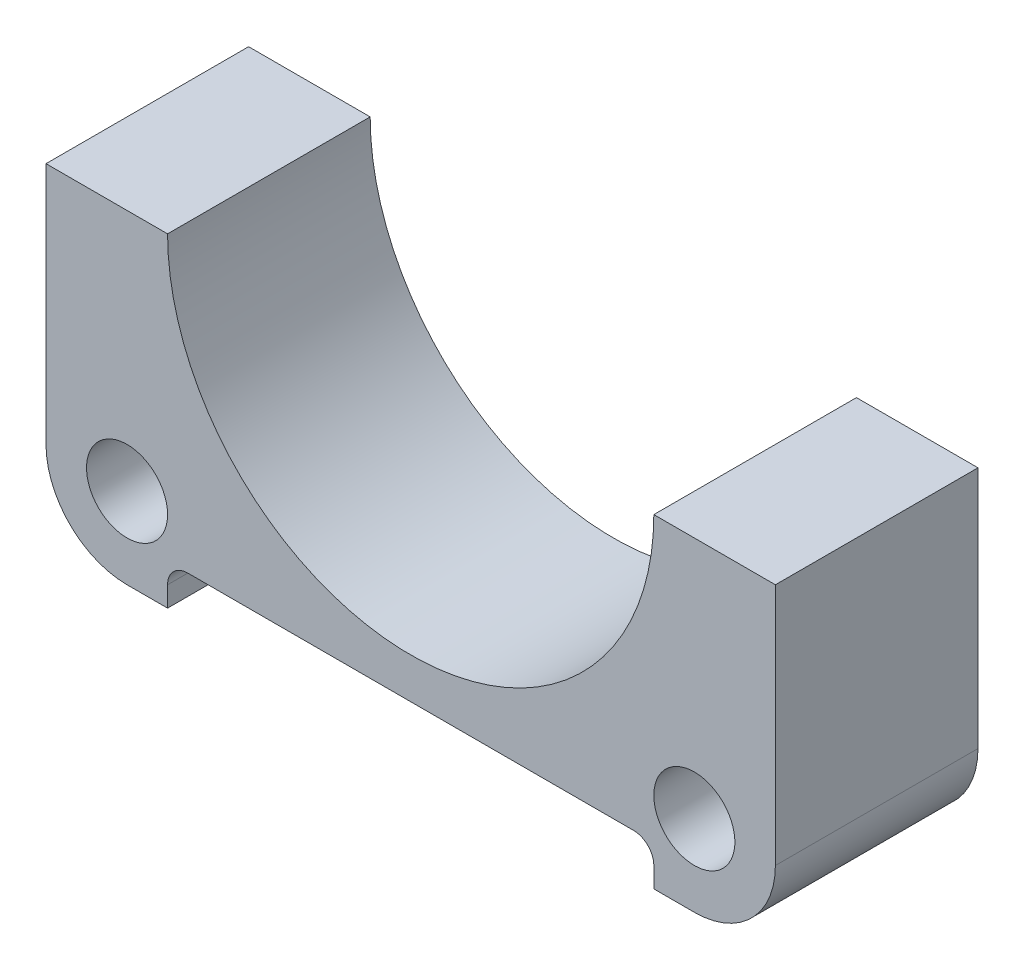
ISO-10303-21;
HEADER;
FILE_DESCRIPTION(('STEP AP214'),'2;1');
FILE_NAME('part.step','',(''),(''),'','','');
FILE_SCHEMA(('AUTOMOTIVE_DESIGN { 1 0 10303 214 1 1 1 1 }'));
ENDSEC;
DATA;
#1=APPLICATION_CONTEXT('core data for automotive mechanical design processes');
#2=APPLICATION_PROTOCOL_DEFINITION('international standard','automotive_design',2000,#1);
#3=PRODUCT_CONTEXT('',#1,'mechanical');
#4=PRODUCT('Part','Part','',(#3));
#5=PRODUCT_RELATED_PRODUCT_CATEGORY('part','',(#4));
#6=PRODUCT_DEFINITION_FORMATION('','',#4);
#7=PRODUCT_DEFINITION_CONTEXT('part definition',#1,'design');
#8=PRODUCT_DEFINITION('design','',#6,#7);
#9=PRODUCT_DEFINITION_SHAPE('','',#8);
#10=(LENGTH_UNIT() NAMED_UNIT(*) SI_UNIT(.MILLI.,.METRE.));
#11=(NAMED_UNIT(*) PLANE_ANGLE_UNIT() SI_UNIT($,.RADIAN.));
#12=(NAMED_UNIT(*) SI_UNIT($,.STERADIAN.) SOLID_ANGLE_UNIT());
#13=UNCERTAINTY_MEASURE_WITH_UNIT(LENGTH_MEASURE(1.E-05),#10,'distance_accuracy_value','');
#14=(GEOMETRIC_REPRESENTATION_CONTEXT(3) GLOBAL_UNCERTAINTY_ASSIGNED_CONTEXT((#13)) GLOBAL_UNIT_ASSIGNED_CONTEXT((#10,
#11,#12)) REPRESENTATION_CONTEXT('',''));
#15=CARTESIAN_POINT('',(0.,0.,0.));
#16=DIRECTION('',(0.,0.,1.));
#17=DIRECTION('',(1.,0.,0.));
#18=AXIS2_PLACEMENT_3D('',#15,#16,#17);
#19=CARTESIAN_POINT('',(0.,0.,50.));
#20=DIRECTION('',(0.,0.,1.));
#21=DIRECTION('',(1.,0.,0.));
#22=AXIS2_PLACEMENT_3D('',#19,#20,#21);
#23=PLANE('',#22);
#24=CARTESIAN_POINT('',(-70.,-60.,50.));
#25=DIRECTION('',(0.,0.,1.));
#26=DIRECTION('',(1.,0.,0.));
#27=AXIS2_PLACEMENT_3D('',#24,#25,#26);
#28=CIRCLE('',#27,10.);
#29=CARTESIAN_POINT('',(-60.,-60.,50.));
#30=VERTEX_POINT('',#29);
#31=EDGE_CURVE('E186',#30,#30,#28,.T.);
#32=ORIENTED_EDGE('',*,*,#31,.F.);
#33=EDGE_LOOP('',(#32));
#34=FACE_BOUND('',#33,.T.);
#35=CARTESIAN_POINT('',(0.,0.,50.));
#36=DIRECTION('',(0.,0.,-1.));
#37=DIRECTION('',(1.,0.,0.));
#38=AXIS2_PLACEMENT_3D('',#35,#36,#37);
#39=CIRCLE('',#38,60.);
#40=CARTESIAN_POINT('',(60.,0.,50.));
#41=VERTEX_POINT('',#40);
#42=CARTESIAN_POINT('',(-60.,0.,50.));
#43=VERTEX_POINT('',#42);
#44=EDGE_CURVE('E223',#41,#43,#39,.T.);
#45=ORIENTED_EDGE('',*,*,#44,.T.);
#46=DIRECTION('',(-1.,0.,0.));
#47=VECTOR('',#46,1.);
#48=CARTESIAN_POINT('',(-60.,0.,50.));
#49=LINE('',#48,#47);
#50=CARTESIAN_POINT('',(-90.,0.,50.));
#51=VERTEX_POINT('',#50);
#52=EDGE_CURVE('E121',#43,#51,#49,.T.);
#53=ORIENTED_EDGE('',*,*,#52,.T.);
#54=DIRECTION('',(0.,-1.,0.));
#55=VECTOR('',#54,1.);
#56=CARTESIAN_POINT('',(-90.,0.,50.));
#57=LINE('',#56,#55);
#58=CARTESIAN_POINT('',(-90.,-59.9999999999999,50.));
#59=VERTEX_POINT('',#58);
#60=EDGE_CURVE('E267',#51,#59,#57,.T.);
#61=ORIENTED_EDGE('',*,*,#60,.T.);
#62=CARTESIAN_POINT('',(-70.,-60.,50.));
#63=DIRECTION('',(0.,0.,1.));
#64=DIRECTION('',(-1.,0.,0.));
#65=AXIS2_PLACEMENT_3D('',#62,#63,#64);
#66=CIRCLE('',#65,20.);
#67=CARTESIAN_POINT('',(-69.9999999999998,-80.,50.));
#68=VERTEX_POINT('',#67);
#69=EDGE_CURVE('E289',#59,#68,#66,.T.);
#70=ORIENTED_EDGE('',*,*,#69,.T.);
#71=DIRECTION('',(1.,0.,0.));
#72=VECTOR('',#71,1.);
#73=CARTESIAN_POINT('',(-69.9999999999998,-80.,50.));
#74=LINE('',#73,#72);
#75=CARTESIAN_POINT('',(-60.,-80.,50.));
#76=VERTEX_POINT('',#75);
#77=EDGE_CURVE('E285',#68,#76,#74,.T.);
#78=ORIENTED_EDGE('',*,*,#77,.T.);
#79=DIRECTION('',(0.,1.,0.));
#80=VECTOR('',#79,1.);
#81=CARTESIAN_POINT('',(-60.,-80.,50.));
#82=LINE('',#81,#80);
#83=CARTESIAN_POINT('',(-60.,-75.0000000000001,50.));
#84=VERTEX_POINT('',#83);
#85=EDGE_CURVE('E288',#76,#84,#82,.T.);
#86=ORIENTED_EDGE('',*,*,#85,.T.);
#87=CARTESIAN_POINT('',(-55.,-75.,50.));
#88=DIRECTION('',(0.,0.,-1.));
#89=DIRECTION('',(-1.,0.,0.));
#90=AXIS2_PLACEMENT_3D('',#87,#88,#89);
#91=CIRCLE('',#90,5.);
#92=CARTESIAN_POINT('',(-54.9999999999999,-70.,50.));
#93=VERTEX_POINT('',#92);
#94=EDGE_CURVE('E293',#84,#93,#91,.T.);
#95=ORIENTED_EDGE('',*,*,#94,.T.);
#96=DIRECTION('',(1.,0.,0.));
#97=VECTOR('',#96,1.);
#98=CARTESIAN_POINT('',(-54.9999999999999,-70.,50.));
#99=LINE('',#98,#97);
#100=CARTESIAN_POINT('',(54.9999999999999,-70.,50.));
#101=VERTEX_POINT('',#100);
#102=EDGE_CURVE('E300',#93,#101,#99,.T.);
#103=ORIENTED_EDGE('',*,*,#102,.T.);
#104=CARTESIAN_POINT('',(55.,-75.,50.));
#105=DIRECTION('',(0.,0.,-1.));
#106=DIRECTION('',(1.,0.,0.));
#107=AXIS2_PLACEMENT_3D('',#104,#105,#106);
#108=CIRCLE('',#107,5.);
#109=CARTESIAN_POINT('',(60.,-75.0000000000001,50.));
#110=VERTEX_POINT('',#109);
#111=EDGE_CURVE('E303',#101,#110,#108,.T.);
#112=ORIENTED_EDGE('',*,*,#111,.T.);
#113=DIRECTION('',(0.,-1.,0.));
#114=VECTOR('',#113,1.);
#115=CARTESIAN_POINT('',(60.,-80.,50.));
#116=LINE('',#115,#114);
#117=CARTESIAN_POINT('',(60.,-80.,50.));
#118=VERTEX_POINT('',#117);
#119=EDGE_CURVE('E306',#110,#118,#116,.T.);
#120=ORIENTED_EDGE('',*,*,#119,.T.);
#121=DIRECTION('',(1.,0.,0.));
#122=VECTOR('',#121,1.);
#123=CARTESIAN_POINT('',(69.9999999999998,-80.,50.));
#124=LINE('',#123,#122);
#125=CARTESIAN_POINT('',(69.9999999999998,-80.,50.));
#126=VERTEX_POINT('',#125);
#127=EDGE_CURVE('E158',#118,#126,#124,.T.);
#128=ORIENTED_EDGE('',*,*,#127,.T.);
#129=CARTESIAN_POINT('',(70.,-60.,50.));
#130=DIRECTION('',(0.,0.,1.));
#131=DIRECTION('',(1.,0.,0.));
#132=AXIS2_PLACEMENT_3D('',#129,#130,#131);
#133=CIRCLE('',#132,20.);
#134=CARTESIAN_POINT('',(90.,-60.,50.));
#135=VERTEX_POINT('',#134);
#136=EDGE_CURVE('E152',#126,#135,#133,.T.);
#137=ORIENTED_EDGE('',*,*,#136,.T.);
#138=DIRECTION('',(0.,1.,0.));
#139=VECTOR('',#138,1.);
#140=CARTESIAN_POINT('',(90.,-7.72372418851806,50.));
#141=LINE('',#140,#139);
#142=CARTESIAN_POINT('',(90.,0.,50.));
#143=VERTEX_POINT('',#142);
#144=EDGE_CURVE('E156',#135,#143,#141,.T.);
#145=ORIENTED_EDGE('',*,*,#144,.T.);
#146=DIRECTION('',(-1.,0.,0.));
#147=VECTOR('',#146,1.);
#148=CARTESIAN_POINT('',(60.,0.,50.));
#149=LINE('',#148,#147);
#150=EDGE_CURVE('E61',#143,#41,#149,.T.);
#151=ORIENTED_EDGE('',*,*,#150,.T.);
#152=EDGE_LOOP('',(#45,#53,#61,#70,#78,#86,#95,#103,#112,#120,#128,#137,#145,#151));
#153=FACE_BOUND('',#152,.T.);
#154=CARTESIAN_POINT('',(70.,-60.,50.));
#155=DIRECTION('',(0.,0.,1.));
#156=DIRECTION('',(-1.,0.,0.));
#157=AXIS2_PLACEMENT_3D('',#154,#155,#156);
#158=CIRCLE('',#157,10.);
#159=CARTESIAN_POINT('',(60.,-60.,50.));
#160=VERTEX_POINT('',#159);
#161=EDGE_CURVE('E536',#160,#160,#158,.T.);
#162=ORIENTED_EDGE('',*,*,#161,.F.);
#163=EDGE_LOOP('',(#162));
#164=FACE_BOUND('',#163,.T.);
#165=ADVANCED_FACE('F43',(#34,#153,#164),#23,.T.);
#166=CARTESIAN_POINT('',(0.,0.,0.));
#167=DIRECTION('',(0.,0.,1.));
#168=DIRECTION('',(1.,0.,0.));
#169=AXIS2_PLACEMENT_3D('',#166,#167,#168);
#170=PLANE('',#169);
#171=CARTESIAN_POINT('',(0.,0.,0.));
#172=DIRECTION('',(0.,0.,-1.));
#173=DIRECTION('',(1.,0.,0.));
#174=AXIS2_PLACEMENT_3D('',#171,#172,#173);
#175=CIRCLE('',#174,60.);
#176=CARTESIAN_POINT('',(60.,0.,0.));
#177=VERTEX_POINT('',#176);
#178=CARTESIAN_POINT('',(-60.,0.,0.));
#179=VERTEX_POINT('',#178);
#180=EDGE_CURVE('E181',#177,#179,#175,.T.);
#181=ORIENTED_EDGE('',*,*,#180,.F.);
#182=DIRECTION('',(-1.,0.,0.));
#183=VECTOR('',#182,1.);
#184=CARTESIAN_POINT('',(60.,0.,0.));
#185=LINE('',#184,#183);
#186=CARTESIAN_POINT('',(90.,0.,0.));
#187=VERTEX_POINT('',#186);
#188=EDGE_CURVE('E113',#187,#177,#185,.T.);
#189=ORIENTED_EDGE('',*,*,#188,.F.);
#190=DIRECTION('',(0.,1.,0.));
#191=VECTOR('',#190,1.);
#192=CARTESIAN_POINT('',(90.,0.,0.));
#193=LINE('',#192,#191);
#194=CARTESIAN_POINT('',(90.,-60.,0.));
#195=VERTEX_POINT('',#194);
#196=EDGE_CURVE('E107',#195,#187,#193,.T.);
#197=ORIENTED_EDGE('',*,*,#196,.F.);
#198=CARTESIAN_POINT('',(70.,-60.,0.));
#199=DIRECTION('',(0.,0.,1.));
#200=DIRECTION('',(1.,0.,0.));
#201=AXIS2_PLACEMENT_3D('',#198,#199,#200);
#202=CIRCLE('',#201,20.);
#203=CARTESIAN_POINT('',(69.9999999999998,-80.,0.));
#204=VERTEX_POINT('',#203);
#205=EDGE_CURVE('E168',#204,#195,#202,.T.);
#206=ORIENTED_EDGE('',*,*,#205,.F.);
#207=DIRECTION('',(1.,0.,0.));
#208=VECTOR('',#207,1.);
#209=CARTESIAN_POINT('',(69.9999999999998,-80.,0.));
#210=LINE('',#209,#208);
#211=CARTESIAN_POINT('',(60.,-80.,0.));
#212=VERTEX_POINT('',#211);
#213=EDGE_CURVE('E214',#212,#204,#210,.T.);
#214=ORIENTED_EDGE('',*,*,#213,.F.);
#215=DIRECTION('',(0.,-1.,0.));
#216=VECTOR('',#215,1.);
#217=CARTESIAN_POINT('',(60.,-80.,0.));
#218=LINE('',#217,#216);
#219=CARTESIAN_POINT('',(60.,-75.0000000000001,0.));
#220=VERTEX_POINT('',#219);
#221=EDGE_CURVE('E211',#220,#212,#218,.T.);
#222=ORIENTED_EDGE('',*,*,#221,.F.);
#223=CARTESIAN_POINT('',(55.,-75.,0.));
#224=DIRECTION('',(0.,0.,-1.));
#225=DIRECTION('',(1.,0.,0.));
#226=AXIS2_PLACEMENT_3D('',#223,#224,#225);
#227=CIRCLE('',#226,5.);
#228=CARTESIAN_POINT('',(54.9999999999999,-70.,0.));
#229=VERTEX_POINT('',#228);
#230=EDGE_CURVE('E208',#229,#220,#227,.T.);
#231=ORIENTED_EDGE('',*,*,#230,.F.);
#232=DIRECTION('',(1.,0.,0.));
#233=VECTOR('',#232,1.);
#234=CARTESIAN_POINT('',(-54.9999999999999,-70.,0.));
#235=LINE('',#234,#233);
#236=CARTESIAN_POINT('',(-54.9999999999999,-70.,0.));
#237=VERTEX_POINT('',#236);
#238=EDGE_CURVE('E205',#237,#229,#235,.T.);
#239=ORIENTED_EDGE('',*,*,#238,.F.);
#240=CARTESIAN_POINT('',(-55.,-75.,0.));
#241=DIRECTION('',(0.,0.,-1.));
#242=DIRECTION('',(-1.,0.,0.));
#243=AXIS2_PLACEMENT_3D('',#240,#241,#242);
#244=CIRCLE('',#243,5.);
#245=CARTESIAN_POINT('',(-60.,-75.0000000000001,0.));
#246=VERTEX_POINT('',#245);
#247=EDGE_CURVE('E202',#246,#237,#244,.T.);
#248=ORIENTED_EDGE('',*,*,#247,.F.);
#249=DIRECTION('',(0.,1.,0.));
#250=VECTOR('',#249,1.);
#251=CARTESIAN_POINT('',(-60.,-80.,0.));
#252=LINE('',#251,#250);
#253=CARTESIAN_POINT('',(-60.,-80.,0.));
#254=VERTEX_POINT('',#253);
#255=EDGE_CURVE('E199',#254,#246,#252,.T.);
#256=ORIENTED_EDGE('',*,*,#255,.F.);
#257=DIRECTION('',(1.,0.,0.));
#258=VECTOR('',#257,1.);
#259=CARTESIAN_POINT('',(-69.9999999999998,-80.,0.));
#260=LINE('',#259,#258);
#261=CARTESIAN_POINT('',(-69.9999999999998,-80.,0.));
#262=VERTEX_POINT('',#261);
#263=EDGE_CURVE('E196',#262,#254,#260,.T.);
#264=ORIENTED_EDGE('',*,*,#263,.F.);
#265=CARTESIAN_POINT('',(-70.,-60.,0.));
#266=DIRECTION('',(0.,0.,1.));
#267=DIRECTION('',(-1.,0.,0.));
#268=AXIS2_PLACEMENT_3D('',#265,#266,#267);
#269=CIRCLE('',#268,20.);
#270=CARTESIAN_POINT('',(-90.,-59.9999999999999,0.));
#271=VERTEX_POINT('',#270);
#272=EDGE_CURVE('E193',#271,#262,#269,.T.);
#273=ORIENTED_EDGE('',*,*,#272,.F.);
#274=DIRECTION('',(0.,-1.,0.));
#275=VECTOR('',#274,1.);
#276=CARTESIAN_POINT('',(-90.,-7.72372418851808,0.));
#277=LINE('',#276,#275);
#278=CARTESIAN_POINT('',(-90.,0.,0.));
#279=VERTEX_POINT('',#278);
#280=EDGE_CURVE('E190',#279,#271,#277,.T.);
#281=ORIENTED_EDGE('',*,*,#280,.F.);
#282=DIRECTION('',(-1.,0.,0.));
#283=VECTOR('',#282,1.);
#284=CARTESIAN_POINT('',(-60.,0.,0.));
#285=LINE('',#284,#283);
#286=EDGE_CURVE('E185',#179,#279,#285,.T.);
#287=ORIENTED_EDGE('',*,*,#286,.F.);
#288=EDGE_LOOP('',(#181,#189,#197,#206,#214,#222,#231,#239,#248,#256,#264,#273,#281,#287));
#289=FACE_BOUND('',#288,.T.);
#290=CARTESIAN_POINT('',(-70.,-60.,0.));
#291=DIRECTION('',(0.,0.,1.));
#292=DIRECTION('',(1.,0.,0.));
#293=AXIS2_PLACEMENT_3D('',#290,#291,#292);
#294=CIRCLE('',#293,10.);
#295=CARTESIAN_POINT('',(-60.,-60.,0.));
#296=VERTEX_POINT('',#295);
#297=EDGE_CURVE('E531',#296,#296,#294,.T.);
#298=ORIENTED_EDGE('',*,*,#297,.T.);
#299=EDGE_LOOP('',(#298));
#300=FACE_BOUND('',#299,.T.);
#301=CARTESIAN_POINT('',(70.,-60.,0.));
#302=DIRECTION('',(0.,0.,1.));
#303=DIRECTION('',(-1.,0.,0.));
#304=AXIS2_PLACEMENT_3D('',#301,#302,#303);
#305=CIRCLE('',#304,10.);
#306=CARTESIAN_POINT('',(60.,-60.,0.));
#307=VERTEX_POINT('',#306);
#308=EDGE_CURVE('E540',#307,#307,#305,.T.);
#309=ORIENTED_EDGE('',*,*,#308,.T.);
#310=EDGE_LOOP('',(#309));
#311=FACE_BOUND('',#310,.T.);
#312=ADVANCED_FACE('F272',(#289,#300,#311),#170,.F.);
#313=CARTESIAN_POINT('',(0.,0.,50.));
#314=DIRECTION('',(0.,0.,-1.));
#315=DIRECTION('',(-1.,0.,0.));
#316=AXIS2_PLACEMENT_3D('',#313,#314,#315);
#317=CYLINDRICAL_SURFACE('',#316,60.);
#318=ORIENTED_EDGE('',*,*,#180,.T.);
#319=DIRECTION('',(0.,0.,-1.));
#320=VECTOR('',#319,1.);
#321=CARTESIAN_POINT('',(-60.,0.,50.));
#322=LINE('',#321,#320);
#323=EDGE_CURVE('E11',#43,#179,#322,.T.);
#324=ORIENTED_EDGE('',*,*,#323,.F.);
#325=ORIENTED_EDGE('',*,*,#44,.F.);
#326=DIRECTION('',(0.,0.,-1.));
#327=VECTOR('',#326,1.);
#328=CARTESIAN_POINT('',(60.,0.,50.));
#329=LINE('',#328,#327);
#330=EDGE_CURVE('E177',#41,#177,#329,.T.);
#331=ORIENTED_EDGE('',*,*,#330,.T.);
#332=EDGE_LOOP('',(#318,#324,#325,#331));
#333=FACE_BOUND('',#332,.T.);
#334=ADVANCED_FACE('F45',(#333),#317,.F.);
#335=CARTESIAN_POINT('',(-60.,0.,50.));
#336=DIRECTION('',(0.,-1.,0.));
#337=DIRECTION('',(1.,0.,0.));
#338=AXIS2_PLACEMENT_3D('',#335,#336,#337);
#339=PLANE('',#338);
#340=ORIENTED_EDGE('',*,*,#286,.T.);
#341=DIRECTION('',(0.,0.,-1.));
#342=VECTOR('',#341,1.);
#343=CARTESIAN_POINT('',(-90.,0.,50.));
#344=LINE('',#343,#342);
#345=EDGE_CURVE('E53',#51,#279,#344,.T.);
#346=ORIENTED_EDGE('',*,*,#345,.F.);
#347=ORIENTED_EDGE('',*,*,#52,.F.);
#348=ORIENTED_EDGE('',*,*,#323,.T.);
#349=EDGE_LOOP('',(#340,#346,#347,#348));
#350=FACE_BOUND('',#349,.T.);
#351=ADVANCED_FACE('F268',(#350),#339,.F.);
#352=CARTESIAN_POINT('',(-90.,-7.72372418851808,50.));
#353=DIRECTION('',(1.,0.,0.));
#354=DIRECTION('',(0.,1.,0.));
#355=AXIS2_PLACEMENT_3D('',#352,#353,#354);
#356=PLANE('',#355);
#357=ORIENTED_EDGE('',*,*,#280,.T.);
#358=DIRECTION('',(0.,0.,-1.));
#359=VECTOR('',#358,1.);
#360=CARTESIAN_POINT('',(-90.,-59.9999999999999,50.));
#361=LINE('',#360,#359);
#362=EDGE_CURVE('E258',#59,#271,#361,.T.);
#363=ORIENTED_EDGE('',*,*,#362,.F.);
#364=ORIENTED_EDGE('',*,*,#60,.F.);
#365=ORIENTED_EDGE('',*,*,#345,.T.);
#366=EDGE_LOOP('',(#357,#363,#364,#365));
#367=FACE_BOUND('',#366,.T.);
#368=ADVANCED_FACE('F265',(#367),#356,.F.);
#369=CARTESIAN_POINT('',(-70.,-60.,50.));
#370=DIRECTION('',(0.,0.,-1.));
#371=DIRECTION('',(-1.,0.,0.));
#372=AXIS2_PLACEMENT_3D('',#369,#370,#371);
#373=CYLINDRICAL_SURFACE('',#372,20.);
#374=ORIENTED_EDGE('',*,*,#272,.T.);
#375=DIRECTION('',(0.,0.,-1.));
#376=VECTOR('',#375,1.);
#377=CARTESIAN_POINT('',(-69.9999999999998,-80.,50.));
#378=LINE('',#377,#376);
#379=EDGE_CURVE('E254',#68,#262,#378,.T.);
#380=ORIENTED_EDGE('',*,*,#379,.F.);
#381=ORIENTED_EDGE('',*,*,#69,.F.);
#382=ORIENTED_EDGE('',*,*,#362,.T.);
#383=EDGE_LOOP('',(#374,#380,#381,#382));
#384=FACE_BOUND('',#383,.T.);
#385=ADVANCED_FACE('F279',(#384),#373,.T.);
#386=CARTESIAN_POINT('',(-69.9999999999998,-80.,50.));
#387=DIRECTION('',(0.,1.,0.));
#388=DIRECTION('',(0.,0.,1.));
#389=AXIS2_PLACEMENT_3D('',#386,#387,#388);
#390=PLANE('',#389);
#391=ORIENTED_EDGE('',*,*,#263,.T.);
#392=DIRECTION('',(0.,0.,-1.));
#393=VECTOR('',#392,1.);
#394=CARTESIAN_POINT('',(-60.,-80.,50.));
#395=LINE('',#394,#393);
#396=EDGE_CURVE('E250',#76,#254,#395,.T.);
#397=ORIENTED_EDGE('',*,*,#396,.F.);
#398=ORIENTED_EDGE('',*,*,#77,.F.);
#399=ORIENTED_EDGE('',*,*,#379,.T.);
#400=EDGE_LOOP('',(#391,#397,#398,#399));
#401=FACE_BOUND('',#400,.T.);
#402=ADVANCED_FACE('F283',(#401),#390,.F.);
#403=CARTESIAN_POINT('',(-60.,-80.,50.));
#404=DIRECTION('',(-1.,0.,0.));
#405=DIRECTION('',(0.,0.,1.));
#406=AXIS2_PLACEMENT_3D('',#403,#404,#405);
#407=PLANE('',#406);
#408=ORIENTED_EDGE('',*,*,#255,.T.);
#409=DIRECTION('',(0.,0.,-1.));
#410=VECTOR('',#409,1.);
#411=CARTESIAN_POINT('',(-60.,-75.0000000000001,50.));
#412=LINE('',#411,#410);
#413=EDGE_CURVE('E246',#84,#246,#412,.T.);
#414=ORIENTED_EDGE('',*,*,#413,.F.);
#415=ORIENTED_EDGE('',*,*,#85,.F.);
#416=ORIENTED_EDGE('',*,*,#396,.T.);
#417=EDGE_LOOP('',(#408,#414,#415,#416));
#418=FACE_BOUND('',#417,.T.);
#419=ADVANCED_FACE('F334',(#418),#407,.F.);
#420=CARTESIAN_POINT('',(-55.,-75.,50.));
#421=DIRECTION('',(0.,0.,-1.));
#422=DIRECTION('',(-1.,0.,0.));
#423=AXIS2_PLACEMENT_3D('',#420,#421,#422);
#424=CYLINDRICAL_SURFACE('',#423,5.);
#425=ORIENTED_EDGE('',*,*,#247,.T.);
#426=DIRECTION('',(0.,0.,-1.));
#427=VECTOR('',#426,1.);
#428=CARTESIAN_POINT('',(-54.9999999999999,-70.,50.));
#429=LINE('',#428,#427);
#430=EDGE_CURVE('E242',#93,#237,#429,.T.);
#431=ORIENTED_EDGE('',*,*,#430,.F.);
#432=ORIENTED_EDGE('',*,*,#94,.F.);
#433=ORIENTED_EDGE('',*,*,#413,.T.);
#434=EDGE_LOOP('',(#425,#431,#432,#433));
#435=FACE_BOUND('',#434,.T.);
#436=ADVANCED_FACE('F331',(#435),#424,.F.);
#437=CARTESIAN_POINT('',(-54.9999999999999,-70.,50.));
#438=DIRECTION('',(0.,1.,0.));
#439=DIRECTION('',(0.,0.,1.));
#440=AXIS2_PLACEMENT_3D('',#437,#438,#439);
#441=PLANE('',#440);
#442=ORIENTED_EDGE('',*,*,#238,.T.);
#443=DIRECTION('',(0.,0.,-1.));
#444=VECTOR('',#443,1.);
#445=CARTESIAN_POINT('',(54.9999999999999,-70.,50.));
#446=LINE('',#445,#444);
#447=EDGE_CURVE('E238',#101,#229,#446,.T.);
#448=ORIENTED_EDGE('',*,*,#447,.F.);
#449=ORIENTED_EDGE('',*,*,#102,.F.);
#450=ORIENTED_EDGE('',*,*,#430,.T.);
#451=EDGE_LOOP('',(#442,#448,#449,#450));
#452=FACE_BOUND('',#451,.T.);
#453=ADVANCED_FACE('F327',(#452),#441,.F.);
#454=CARTESIAN_POINT('',(55.,-75.,50.));
#455=DIRECTION('',(0.,0.,-1.));
#456=DIRECTION('',(-1.,0.,0.));
#457=AXIS2_PLACEMENT_3D('',#454,#455,#456);
#458=CYLINDRICAL_SURFACE('',#457,5.);
#459=ORIENTED_EDGE('',*,*,#230,.T.);
#460=DIRECTION('',(0.,0.,-1.));
#461=VECTOR('',#460,1.);
#462=CARTESIAN_POINT('',(60.,-75.0000000000001,50.));
#463=LINE('',#462,#461);
#464=EDGE_CURVE('E234',#110,#220,#463,.T.);
#465=ORIENTED_EDGE('',*,*,#464,.F.);
#466=ORIENTED_EDGE('',*,*,#111,.F.);
#467=ORIENTED_EDGE('',*,*,#447,.T.);
#468=EDGE_LOOP('',(#459,#465,#466,#467));
#469=FACE_BOUND('',#468,.T.);
#470=ADVANCED_FACE('F323',(#469),#458,.F.);
#471=CARTESIAN_POINT('',(60.,-80.,50.));
#472=DIRECTION('',(1.,0.,0.));
#473=DIRECTION('',(0.,1.,0.));
#474=AXIS2_PLACEMENT_3D('',#471,#472,#473);
#475=PLANE('',#474);
#476=ORIENTED_EDGE('',*,*,#221,.T.);
#477=DIRECTION('',(0.,0.,-1.));
#478=VECTOR('',#477,1.);
#479=CARTESIAN_POINT('',(60.,-80.,50.));
#480=LINE('',#479,#478);
#481=EDGE_CURVE('E230',#118,#212,#480,.T.);
#482=ORIENTED_EDGE('',*,*,#481,.F.);
#483=ORIENTED_EDGE('',*,*,#119,.F.);
#484=ORIENTED_EDGE('',*,*,#464,.T.);
#485=EDGE_LOOP('',(#476,#482,#483,#484));
#486=FACE_BOUND('',#485,.T.);
#487=ADVANCED_FACE('F314',(#486),#475,.F.);
#488=CARTESIAN_POINT('',(69.9999999999998,-80.,50.));
#489=DIRECTION('',(0.,1.,0.));
#490=DIRECTION('',(0.,0.,1.));
#491=AXIS2_PLACEMENT_3D('',#488,#489,#490);
#492=PLANE('',#491);
#493=ORIENTED_EDGE('',*,*,#213,.T.);
#494=DIRECTION('',(0.,0.,-1.));
#495=VECTOR('',#494,1.);
#496=CARTESIAN_POINT('',(69.9999999999998,-80.,50.));
#497=LINE('',#496,#495);
#498=EDGE_CURVE('E170',#126,#204,#497,.T.);
#499=ORIENTED_EDGE('',*,*,#498,.F.);
#500=ORIENTED_EDGE('',*,*,#127,.F.);
#501=ORIENTED_EDGE('',*,*,#481,.T.);
#502=EDGE_LOOP('',(#493,#499,#500,#501));
#503=FACE_BOUND('',#502,.T.);
#504=ADVANCED_FACE('F318',(#503),#492,.F.);
#505=CARTESIAN_POINT('',(70.,-60.,50.));
#506=DIRECTION('',(0.,0.,-1.));
#507=DIRECTION('',(-1.,0.,0.));
#508=AXIS2_PLACEMENT_3D('',#505,#506,#507);
#509=CYLINDRICAL_SURFACE('',#508,20.);
#510=ORIENTED_EDGE('',*,*,#205,.T.);
#511=DIRECTION('',(0.,0.,-1.));
#512=VECTOR('',#511,1.);
#513=CARTESIAN_POINT('',(90.,-60.,50.));
#514=LINE('',#513,#512);
#515=EDGE_CURVE('E165',#135,#195,#514,.T.);
#516=ORIENTED_EDGE('',*,*,#515,.F.);
#517=ORIENTED_EDGE('',*,*,#136,.F.);
#518=ORIENTED_EDGE('',*,*,#498,.T.);
#519=EDGE_LOOP('',(#510,#516,#517,#518));
#520=FACE_BOUND('',#519,.T.);
#521=ADVANCED_FACE('F166',(#520),#509,.T.);
#522=CARTESIAN_POINT('',(90.,0.,50.));
#523=DIRECTION('',(-1.,0.,0.));
#524=DIRECTION('',(0.,0.,1.));
#525=AXIS2_PLACEMENT_3D('',#522,#523,#524);
#526=PLANE('',#525);
#527=ORIENTED_EDGE('',*,*,#196,.T.);
#528=DIRECTION('',(0.,0.,-1.));
#529=VECTOR('',#528,1.);
#530=CARTESIAN_POINT('',(90.,0.,50.));
#531=LINE('',#530,#529);
#532=EDGE_CURVE('E171',#143,#187,#531,.T.);
#533=ORIENTED_EDGE('',*,*,#532,.F.);
#534=ORIENTED_EDGE('',*,*,#144,.F.);
#535=ORIENTED_EDGE('',*,*,#515,.T.);
#536=EDGE_LOOP('',(#527,#533,#534,#535));
#537=FACE_BOUND('',#536,.T.);
#538=ADVANCED_FACE('F173',(#537),#526,.F.);
#539=CARTESIAN_POINT('',(60.,0.,50.));
#540=DIRECTION('',(0.,-1.,0.));
#541=DIRECTION('',(1.,0.,0.));
#542=AXIS2_PLACEMENT_3D('',#539,#540,#541);
#543=PLANE('',#542);
#544=ORIENTED_EDGE('',*,*,#188,.T.);
#545=ORIENTED_EDGE('',*,*,#330,.F.);
#546=ORIENTED_EDGE('',*,*,#150,.F.);
#547=ORIENTED_EDGE('',*,*,#532,.T.);
#548=EDGE_LOOP('',(#544,#545,#546,#547));
#549=FACE_BOUND('',#548,.T.);
#550=ADVANCED_FACE('F355',(#549),#543,.F.);
#551=CARTESIAN_POINT('',(-70.,-60.,50.));
#552=DIRECTION('',(0.,0.,-1.));
#553=DIRECTION('',(-1.,0.,0.));
#554=AXIS2_PLACEMENT_3D('',#551,#552,#553);
#555=CYLINDRICAL_SURFACE('',#554,10.);
#556=ORIENTED_EDGE('',*,*,#31,.T.);
#557=EDGE_LOOP('',(#556));
#558=FACE_BOUND('',#557,.T.);
#559=ORIENTED_EDGE('',*,*,#297,.F.);
#560=EDGE_LOOP('',(#559));
#561=FACE_BOUND('',#560,.T.);
#562=ADVANCED_FACE('F352',(#558,#561),#555,.F.);
#563=CARTESIAN_POINT('',(70.,-60.,50.));
#564=DIRECTION('',(0.,0.,-1.));
#565=DIRECTION('',(-1.,0.,0.));
#566=AXIS2_PLACEMENT_3D('',#563,#564,#565);
#567=CYLINDRICAL_SURFACE('',#566,10.);
#568=ORIENTED_EDGE('',*,*,#161,.T.);
#569=EDGE_LOOP('',(#568));
#570=FACE_BOUND('',#569,.T.);
#571=ORIENTED_EDGE('',*,*,#308,.F.);
#572=EDGE_LOOP('',(#571));
#573=FACE_BOUND('',#572,.T.);
#574=ADVANCED_FACE('F403',(#570,#573),#567,.F.);
#575=CLOSED_SHELL('',(#165,#312,#334,#351,#368,#385,#402,#419,#436,#453,#470,#487,#504,#521,
#538,#550,#562,#574));
#576=MANIFOLD_SOLID_BREP('B2',#575);
#577=ADVANCED_BREP_SHAPE_REPRESENTATION('',(#18,#576),#14);
#578=SHAPE_DEFINITION_REPRESENTATION(#9,#577);
ENDSEC;
END-ISO-10303-21;
